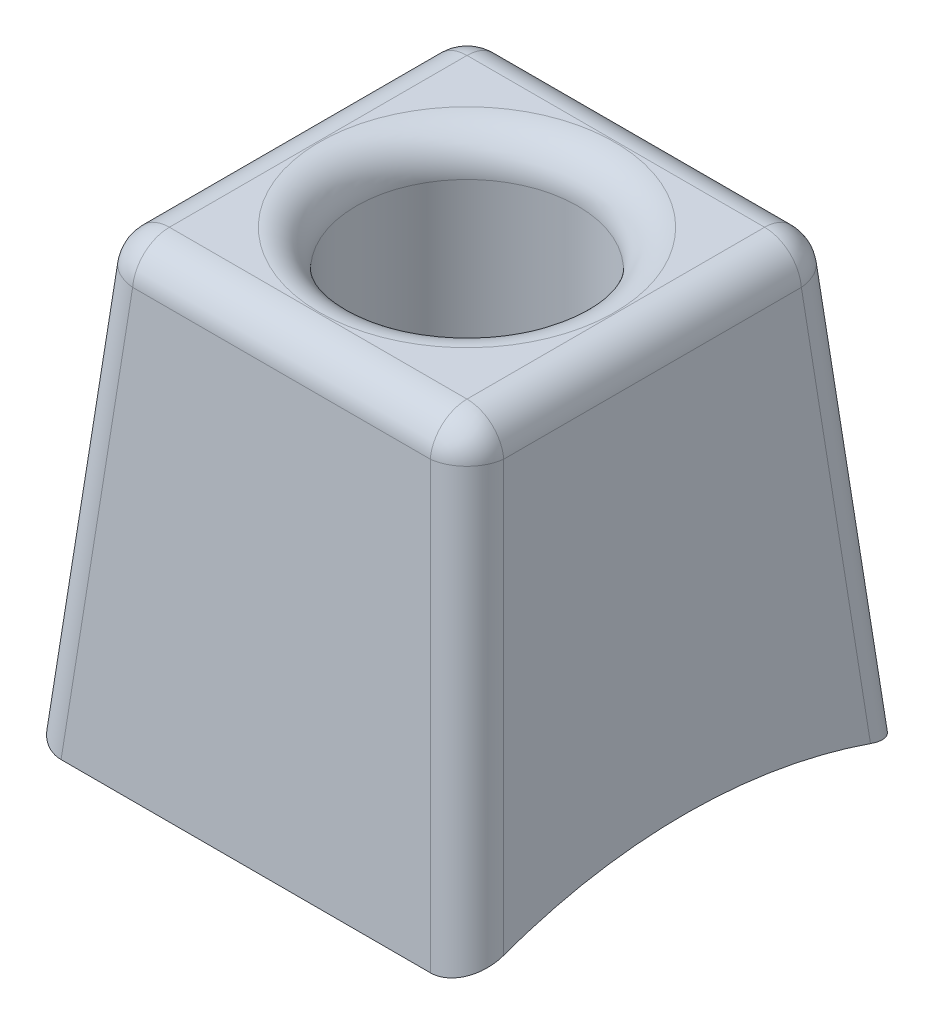
ISO-10303-21;
HEADER;
FILE_DESCRIPTION(('STEP AP214'),'2;1');
FILE_NAME('part.step','',(''),(''),'','','');
FILE_SCHEMA(('AUTOMOTIVE_DESIGN { 1 0 10303 214 1 1 1 1 }'));
ENDSEC;
DATA;
#1=APPLICATION_CONTEXT('core data for automotive mechanical design processes');
#2=APPLICATION_PROTOCOL_DEFINITION('international standard','automotive_design',2000,#1);
#3=PRODUCT_CONTEXT('',#1,'mechanical');
#4=PRODUCT('Part','Part','',(#3));
#5=PRODUCT_RELATED_PRODUCT_CATEGORY('part','',(#4));
#6=PRODUCT_DEFINITION_FORMATION('','',#4);
#7=PRODUCT_DEFINITION_CONTEXT('part definition',#1,'design');
#8=PRODUCT_DEFINITION('design','',#6,#7);
#9=PRODUCT_DEFINITION_SHAPE('','',#8);
#10=(LENGTH_UNIT() NAMED_UNIT(*) SI_UNIT(.MILLI.,.METRE.));
#11=(NAMED_UNIT(*) PLANE_ANGLE_UNIT() SI_UNIT($,.RADIAN.));
#12=(NAMED_UNIT(*) SI_UNIT($,.STERADIAN.) SOLID_ANGLE_UNIT());
#13=UNCERTAINTY_MEASURE_WITH_UNIT(LENGTH_MEASURE(1.E-05),#10,'distance_accuracy_value','');
#14=(GEOMETRIC_REPRESENTATION_CONTEXT(3) GLOBAL_UNCERTAINTY_ASSIGNED_CONTEXT((#13)) GLOBAL_UNIT_ASSIGNED_CONTEXT((#10,
#11,#12)) REPRESENTATION_CONTEXT('',''));
#15=CARTESIAN_POINT('',(0.,0.,0.));
#16=DIRECTION('',(0.,0.,1.));
#17=DIRECTION('',(1.,0.,0.));
#18=AXIS2_PLACEMENT_3D('',#15,#16,#17);
#19=CARTESIAN_POINT('',(0.,0.,0.));
#20=DIRECTION('',(0.996194698091746,0.0871557427476582,0.));
#21=DIRECTION('',(-0.0871557427476582,0.996194698091746,0.));
#22=AXIS2_PLACEMENT_3D('',#19,#20,#21);
#23=PLANE('',#22);
#24=DIRECTION('',(-0.0868265938642476,0.992432509138967,-0.0868265938642476));
#25=VECTOR('',#24,1.);
#26=CARTESIAN_POINT('',(0.00751016977360886,-0.0858416333149665,-0.988684528318136));
#27=LINE('',#26,#25);
#28=CARTESIAN_POINT('',(-0.970000438236766,11.0871557427477,-1.96619513632851));
#29=VERTEX_POINT('',#28);
#30=CARTESIAN_POINT('',(-0.0328801020594315,0.375821286259433,-1.02907480015118));
#31=VERTEX_POINT('',#30);
#32=EDGE_CURVE('E140',#29,#31,#27,.F.);
#33=ORIENTED_EDGE('',*,*,#32,.T.);
#34=CARTESIAN_POINT('',(1.29766658815796,-14.8323969741913,-6.));
#35=DIRECTION('',(0.996194698091746,0.0871557427476582,0.));
#36=DIRECTION('',(0.0871557427476582,-0.996194698091746,0.));
#37=AXIS2_PLACEMENT_3D('',#34,#35,#36);
#38=ELLIPSE('',#37,16.0611174006936,16.);
#39=CARTESIAN_POINT('',(-0.0328801020594315,0.375821286259436,-10.9709251998488));
#40=VERTEX_POINT('',#39);
#41=EDGE_CURVE('E258',#31,#40,#38,.F.);
#42=ORIENTED_EDGE('',*,*,#41,.T.);
#43=DIRECTION('',(-0.0868265938642476,0.992432509138967,0.0868265938642477));
#44=VECTOR('',#43,1.);
#45=CARTESIAN_POINT('',(-0.0829561190511952,0.948192779589257,-10.9208491828571));
#46=LINE('',#45,#44);
#47=CARTESIAN_POINT('',(-0.970000438236766,11.0871557427477,-10.0338048636715));
#48=VERTEX_POINT('',#47);
#49=EDGE_CURVE('E148',#40,#48,#46,.T.);
#50=ORIENTED_EDGE('',*,*,#49,.T.);
#51=DIRECTION('',(0.,0.,-1.));
#52=VECTOR('',#51,1.);
#53=CARTESIAN_POINT('',(-0.970000438236766,11.0871557427477,-1.04986396231109));
#54=LINE('',#53,#52);
#55=EDGE_CURVE('E138',#48,#29,#54,.F.);
#56=ORIENTED_EDGE('',*,*,#55,.T.);
#57=EDGE_LOOP('',(#33,#42,#50,#56));
#58=FACE_BOUND('',#57,.T.);
#59=ADVANCED_FACE('F34',(#58),#23,.T.);
#60=CARTESIAN_POINT('',(0.,0.,-12.));
#61=DIRECTION('',(0.,0.0871557427476582,-0.996194698091746));
#62=DIRECTION('',(0.,0.996194698091746,0.0871557427476582));
#63=AXIS2_PLACEMENT_3D('',#60,#61,#62);
#64=PLANE('',#63);
#65=DIRECTION('',(-1.,0.,0.));
#66=VECTOR('',#65,1.);
#67=CARTESIAN_POINT('',(0.,0.,-12.));
#68=LINE('',#67,#66);
#69=CARTESIAN_POINT('',(-0.996194698091746,0.,-12.));
#70=VERTEX_POINT('',#69);
#71=CARTESIAN_POINT('',(-11.0038053019083,0.,-12.));
#72=VERTEX_POINT('',#71);
#73=EDGE_CURVE('E118',#70,#72,#68,.T.);
#74=ORIENTED_EDGE('',*,*,#73,.T.);
#75=DIRECTION('',(0.0868265938642476,0.992432509138967,0.0868265938642476));
#76=VECTOR('',#75,1.);
#77=CARTESIAN_POINT('',(-10.9208491828571,0.948192779589257,-11.9170438809488));
#78=LINE('',#77,#76);
#79=CARTESIAN_POINT('',(-10.0338048636715,11.0871557427477,-11.0299995617632));
#80=VERTEX_POINT('',#79);
#81=EDGE_CURVE('E127',#72,#80,#78,.T.);
#82=ORIENTED_EDGE('',*,*,#81,.T.);
#83=DIRECTION('',(-1.,0.,0.));
#84=VECTOR('',#83,1.);
#85=CARTESIAN_POINT('',(-1.04986396231109,11.0871557427477,-11.0299995617632));
#86=LINE('',#85,#84);
#87=CARTESIAN_POINT('',(-1.96619513632851,11.0871557427477,-11.0299995617632));
#88=VERTEX_POINT('',#87);
#89=EDGE_CURVE('E142',#80,#88,#86,.F.);
#90=ORIENTED_EDGE('',*,*,#89,.T.);
#91=DIRECTION('',(-0.0868265938642476,0.992432509138967,0.0868265938642476));
#92=VECTOR('',#91,1.);
#93=CARTESIAN_POINT('',(-0.988684528318137,-0.0858416333149666,-12.0075101697736));
#94=LINE('',#93,#92);
#95=EDGE_CURVE('E130',#88,#70,#94,.F.);
#96=ORIENTED_EDGE('',*,*,#95,.T.);
#97=EDGE_LOOP('',(#74,#82,#90,#96));
#98=FACE_BOUND('',#97,.T.);
#99=ADVANCED_FACE('F126',(#98),#64,.T.);
#100=CARTESIAN_POINT('',(-12.,0.,0.));
#101=DIRECTION('',(-0.996194698091746,0.0871557427476582,0.));
#102=DIRECTION('',(-0.0871557427476582,-0.996194698091746,0.));
#103=AXIS2_PLACEMENT_3D('',#100,#101,#102);
#104=PLANE('',#103);
#105=DIRECTION('',(0.0868265938642476,0.992432509138967,0.0868265938642476));
#106=VECTOR('',#105,1.);
#107=CARTESIAN_POINT('',(-11.9170438809488,0.948192779589257,-10.9208491828571));
#108=LINE('',#107,#106);
#109=CARTESIAN_POINT('',(-11.0299995617632,11.0871557427477,-10.0338048636715));
#110=VERTEX_POINT('',#109);
#111=CARTESIAN_POINT('',(-11.9671198979406,0.375821286259438,-10.9709251998488));
#112=VERTEX_POINT('',#111);
#113=EDGE_CURVE('E222',#110,#112,#108,.F.);
#114=ORIENTED_EDGE('',*,*,#113,.T.);
#115=CARTESIAN_POINT('',(-13.297666588158,-14.8323969741913,-6.));
#116=DIRECTION('',(-0.996194698091746,0.0871557427476582,0.));
#117=DIRECTION('',(0.0871557427476582,0.996194698091746,0.));
#118=AXIS2_PLACEMENT_3D('',#115,#116,#117);
#119=ELLIPSE('',#118,16.0611174006936,16.);
#120=CARTESIAN_POINT('',(-11.9671198979406,0.375821286259433,-1.02907480015118));
#121=VERTEX_POINT('',#120);
#122=EDGE_CURVE('E55',#112,#121,#119,.F.);
#123=ORIENTED_EDGE('',*,*,#122,.T.);
#124=DIRECTION('',(0.0868265938642476,0.992432509138967,-0.0868265938642477));
#125=VECTOR('',#124,1.);
#126=CARTESIAN_POINT('',(-12.0075101697736,-0.0858416333149666,-0.988684528318135));
#127=LINE('',#126,#125);
#128=CARTESIAN_POINT('',(-11.0299995617632,11.0871557427477,-1.96619513632851));
#129=VERTEX_POINT('',#128);
#130=EDGE_CURVE('E220',#121,#129,#127,.T.);
#131=ORIENTED_EDGE('',*,*,#130,.T.);
#132=DIRECTION('',(0.,0.,1.));
#133=VECTOR('',#132,1.);
#134=CARTESIAN_POINT('',(-11.0299995617632,11.0871557427477,-10.9501360376889));
#135=LINE('',#134,#133);
#136=EDGE_CURVE('E218',#129,#110,#135,.F.);
#137=ORIENTED_EDGE('',*,*,#136,.T.);
#138=EDGE_LOOP('',(#114,#123,#131,#137));
#139=FACE_BOUND('',#138,.T.);
#140=ADVANCED_FACE('F248',(#139),#104,.T.);
#141=CARTESIAN_POINT('',(0.,0.,0.));
#142=DIRECTION('',(0.,0.0871557427476582,0.996194698091746));
#143=DIRECTION('',(0.,-0.996194698091746,0.0871557427476582));
#144=AXIS2_PLACEMENT_3D('',#141,#142,#143);
#145=PLANE('',#144);
#146=DIRECTION('',(1.,0.,0.));
#147=VECTOR('',#146,1.);
#148=CARTESIAN_POINT('',(0.,0.,0.));
#149=LINE('',#148,#147);
#150=CARTESIAN_POINT('',(-11.0038053019083,0.,0.));
#151=VERTEX_POINT('',#150);
#152=CARTESIAN_POINT('',(-0.996194698091746,0.,0.));
#153=VERTEX_POINT('',#152);
#154=EDGE_CURVE('E131',#151,#153,#149,.T.);
#155=ORIENTED_EDGE('',*,*,#154,.T.);
#156=DIRECTION('',(-0.0868265938642476,0.992432509138967,-0.0868265938642476));
#157=VECTOR('',#156,1.);
#158=CARTESIAN_POINT('',(-0.988684528318136,-0.0858416333149665,0.00751016977360898));
#159=LINE('',#158,#157);
#160=CARTESIAN_POINT('',(-1.96619513632851,11.0871557427477,-0.970000438236766));
#161=VERTEX_POINT('',#160);
#162=EDGE_CURVE('E49',#153,#161,#159,.T.);
#163=ORIENTED_EDGE('',*,*,#162,.T.);
#164=DIRECTION('',(1.,0.,0.));
#165=VECTOR('',#164,1.);
#166=CARTESIAN_POINT('',(-10.9501360376889,11.0871557427477,-0.970000438236765));
#167=LINE('',#166,#165);
#168=CARTESIAN_POINT('',(-10.0338048636715,11.0871557427477,-0.970000438236765));
#169=VERTEX_POINT('',#168);
#170=EDGE_CURVE('E63',#161,#169,#167,.F.);
#171=ORIENTED_EDGE('',*,*,#170,.T.);
#172=DIRECTION('',(0.0868265938642476,0.992432509138967,-0.0868265938642476));
#173=VECTOR('',#172,1.);
#174=CARTESIAN_POINT('',(-10.9208491828571,0.948192779589257,-0.0829561190511938));
#175=LINE('',#174,#173);
#176=EDGE_CURVE('E151',#169,#151,#175,.F.);
#177=ORIENTED_EDGE('',*,*,#176,.T.);
#178=EDGE_LOOP('',(#155,#163,#171,#177));
#179=FACE_BOUND('',#178,.T.);
#180=ADVANCED_FACE('F255',(#179),#145,.T.);
#181=CARTESIAN_POINT('',(0.,12.,0.));
#182=DIRECTION('',(0.,1.,0.));
#183=DIRECTION('',(0.,0.,1.));
#184=AXIS2_PLACEMENT_3D('',#181,#182,#183);
#185=PLANE('',#184);
#186=CARTESIAN_POINT('',(-6.,12.,-6.));
#187=DIRECTION('',(0.,1.,0.));
#188=DIRECTION('',(0.,0.,1.));
#189=AXIS2_PLACEMENT_3D('',#186,#187,#188);
#190=CIRCLE('',#189,4.);
#191=CARTESIAN_POINT('',(-6.,12.,-2.));
#192=VERTEX_POINT('',#191);
#193=EDGE_CURVE('E215',#192,#192,#190,.F.);
#194=ORIENTED_EDGE('',*,*,#193,.T.);
#195=EDGE_LOOP('',(#194));
#196=FACE_BOUND('',#195,.T.);
#197=DIRECTION('',(0.,0.,1.));
#198=VECTOR('',#197,1.);
#199=CARTESIAN_POINT('',(-1.96619513632851,12.,-10.9501360376889));
#200=LINE('',#199,#198);
#201=CARTESIAN_POINT('',(-1.96619513632851,12.,-1.96619513632851));
#202=VERTEX_POINT('',#201);
#203=CARTESIAN_POINT('',(-1.96619513632851,12.,-10.0338048636715));
#204=VERTEX_POINT('',#203);
#205=EDGE_CURVE('E199',#202,#204,#200,.F.);
#206=ORIENTED_EDGE('',*,*,#205,.T.);
#207=DIRECTION('',(1.,0.,0.));
#208=VECTOR('',#207,1.);
#209=CARTESIAN_POINT('',(-10.9501360376889,12.,-10.0338048636715));
#210=LINE('',#209,#208);
#211=CARTESIAN_POINT('',(-10.0338048636715,12.,-10.0338048636715));
#212=VERTEX_POINT('',#211);
#213=EDGE_CURVE('E213',#204,#212,#210,.F.);
#214=ORIENTED_EDGE('',*,*,#213,.T.);
#215=DIRECTION('',(0.,0.,-1.));
#216=VECTOR('',#215,1.);
#217=CARTESIAN_POINT('',(-10.0338048636715,12.,-1.04986396231109));
#218=LINE('',#217,#216);
#219=CARTESIAN_POINT('',(-10.0338048636715,12.,-1.96619513632851));
#220=VERTEX_POINT('',#219);
#221=EDGE_CURVE('E206',#212,#220,#218,.F.);
#222=ORIENTED_EDGE('',*,*,#221,.T.);
#223=DIRECTION('',(-1.,0.,0.));
#224=VECTOR('',#223,1.);
#225=CARTESIAN_POINT('',(-1.04986396231109,12.,-1.96619513632851));
#226=LINE('',#225,#224);
#227=EDGE_CURVE('E203',#220,#202,#226,.F.);
#228=ORIENTED_EDGE('',*,*,#227,.T.);
#229=EDGE_LOOP('',(#206,#214,#222,#228));
#230=FACE_BOUND('',#229,.T.);
#231=ADVANCED_FACE('F234',(#196,#230),#185,.T.);
#232=CARTESIAN_POINT('',(-6.,0.,-6.));
#233=DIRECTION('',(0.,1.,0.));
#234=DIRECTION('',(0.,0.,1.));
#235=AXIS2_PLACEMENT_3D('',#232,#233,#234);
#236=CYLINDRICAL_SURFACE('',#235,3.);
#237=CARTESIAN_POINT('',(-6.,0.883836671310385,-3.));
#238=CARTESIAN_POINT('',(-6.16691441602524,0.883839901710043,-3.00000640233411));
#239=CARTESIAN_POINT('',(-6.33391189643725,0.88652462102244,-3.01397747302102));
#240=CARTESIAN_POINT('',(-6.66319792316334,0.896960046087501,-3.06945493496415));
#241=CARTESIAN_POINT('',(-6.82548235285483,0.904715049270513,-3.11098468463053));
#242=CARTESIAN_POINT('',(-7.14053014274188,0.924382555108625,-3.22025928764418));
#243=CARTESIAN_POINT('',(-7.29330221861461,0.936291183929216,-3.2879797209125));
#244=CARTESIAN_POINT('',(-7.58530711857359,0.962919552227247,-3.4476486847927));
#245=CARTESIAN_POINT('',(-7.72454099800659,0.977639072320943,-3.53959532481614));
#246=CARTESIAN_POINT('',(-7.98726039839828,1.00843532258773,-3.74632642114755));
#247=CARTESIAN_POINT('',(-8.11055296694346,1.0245253583223,-3.86135414133816));
#248=CARTESIAN_POINT('',(-8.33620877919912,1.05613217908931,-4.1104564423929));
#249=CARTESIAN_POINT('',(-8.43857064884959,1.07164892643172,-4.24453227275011));
#250=CARTESIAN_POINT('',(-8.62019875320103,1.10050338237679,-4.52919221085967));
#251=CARTESIAN_POINT('',(-8.69928306703884,1.11382358685594,-4.67989431993227));
#252=CARTESIAN_POINT('',(-8.83093908454707,1.13663519846728,-4.99273743349847));
#253=CARTESIAN_POINT('',(-8.88351296798044,1.14612692037535,-5.15487749628099));
#254=CARTESIAN_POINT('',(-8.96005909722227,1.16011812828424,-5.48399450762517));
#255=CARTESIAN_POINT('',(-8.98435661184537,1.16467434533521,-5.65089335351028));
#256=CARTESIAN_POINT('',(-9.0046737754008,1.16847671812056,-5.98645664792923));
#257=CARTESIAN_POINT('',(-9.00069583227812,1.16772332602261,-6.15512094489534));
#258=CARTESIAN_POINT('',(-8.9648244577057,1.1610357010735,-6.48719671579879));
#259=CARTESIAN_POINT('',(-8.93328126113998,1.15516647075295,-6.65064752090294));
#260=CARTESIAN_POINT('',(-8.84372870120953,1.1389795524799,-6.96989433143095));
#261=CARTESIAN_POINT('',(-8.78571837330839,1.12866170240799,-7.12569005765308));
#262=CARTESIAN_POINT('',(-8.6445445378834,1.10462823175546,-7.42622013150304));
#263=CARTESIAN_POINT('',(-8.56124102417501,1.09089377762518,-7.57088714367706));
#264=CARTESIAN_POINT('',(-8.37194866184569,1.06154597666567,-7.84431995442927));
#265=CARTESIAN_POINT('',(-8.26595750622484,1.04593243883195,-7.97308413382157));
#266=CARTESIAN_POINT('',(-8.03236859403294,1.01427329942001,-8.21313123793807));
#267=CARTESIAN_POINT('',(-7.90446443219585,0.998224743841106,-8.32411581514082));
#268=CARTESIAN_POINT('',(-7.63170093744275,0.967733204301089,-8.52310343702521));
#269=CARTESIAN_POINT('',(-7.48684135647073,0.953290243835689,-8.61110614542364));
#270=CARTESIAN_POINT('',(-7.18388345859468,0.927640891951102,-8.76171704448955));
#271=CARTESIAN_POINT('',(-7.02576308561871,0.916440036413894,-8.82428187290843));
#272=CARTESIAN_POINT('',(-6.7009976317536,0.898627873742458,-8.92187313950112));
#273=CARTESIAN_POINT('',(-6.53435351907043,0.892016046581068,-8.95690269802216));
#274=CARTESIAN_POINT('',(-6.19996134228824,0.884233431828783,-8.99799345299478));
#275=CARTESIAN_POINT('',(-6.03226776886897,0.882982142131403,-9.00448328571717));
#276=CARTESIAN_POINT('',(-5.69819308982571,0.885846854225474,-8.98945937763449));
#277=CARTESIAN_POINT('',(-5.53181191970384,0.889962590580894,-8.96794702172866));
#278=CARTESIAN_POINT('',(-5.20649419389123,0.903022627072779,-8.89789736391765));
#279=CARTESIAN_POINT('',(-5.04750749475021,0.911926759626247,-8.84958477167979));
#280=CARTESIAN_POINT('',(-4.73988562053969,0.93352570894105,-8.72754448758119));
#281=CARTESIAN_POINT('',(-4.59125120936934,0.946220805074297,-8.6538149225759));
#282=CARTESIAN_POINT('',(-4.30666476191367,0.974154583082376,-8.4820470623932));
#283=CARTESIAN_POINT('',(-4.17087892426786,0.98942093431498,-8.38373799279242));
#284=CARTESIAN_POINT('',(-3.91757591957134,1.02069925317068,-8.16596688688493));
#285=CARTESIAN_POINT('',(-3.80006039688845,1.03671128773855,-8.04650294866167));
#286=CARTESIAN_POINT('',(-3.58503247293175,1.06793550592759,-7.78789883574077));
#287=CARTESIAN_POINT('',(-3.48780834678807,1.08313414247477,-7.64851706819178));
#288=CARTESIAN_POINT('',(-3.31815758764467,1.11079112201569,-7.35514904608028));
#289=CARTESIAN_POINT('',(-3.24572999994999,1.12324957050319,-7.20116335407705));
#290=CARTESIAN_POINT('',(-3.12815980427184,1.14396418572561,-6.88375508315737));
#291=CARTESIAN_POINT('',(-3.08287562487718,1.15224212041147,-6.72038642615798));
#292=CARTESIAN_POINT('',(-3.02042590342023,1.16375586748361,-6.38819245476314));
#293=CARTESIAN_POINT('',(-3.00325740267459,1.1669922104075,-6.21936771643169));
#294=CARTESIAN_POINT('',(-2.99762939696311,1.16804757611732,-5.88381847949899));
#295=CARTESIAN_POINT('',(-3.00873449374091,1.16594875830869,-5.71710138586749));
#296=CARTESIAN_POINT('',(-3.05838485553691,1.15674035804335,-5.38795326144158));
#297=CARTESIAN_POINT('',(-3.09692985748858,1.14963082362443,-5.22552218957254));
#298=CARTESIAN_POINT('',(-3.20018241476728,1.13119978536725,-4.90978704880911));
#299=CARTESIAN_POINT('',(-3.26484362576144,1.11988574543153,-4.75646736136386));
#300=CARTESIAN_POINT('',(-3.41844090731094,1.09427046719275,-4.4627887373663));
#301=CARTESIAN_POINT('',(-3.50737860421546,1.07996902877065,-4.3224306699923));
#302=CARTESIAN_POINT('',(-3.70850290888246,1.04969862297471,-4.05648994444115));
#303=CARTESIAN_POINT('',(-3.82100406771521,1.03370871751096,-3.93114752922333));
#304=CARTESIAN_POINT('',(-4.06540912499362,1.00199569670852,-3.7009692786859));
#305=CARTESIAN_POINT('',(-4.19731758077808,0.986272645003964,-3.59613827348799));
#306=CARTESIAN_POINT('',(-4.47825290938013,0.956714573862472,-3.40904732110595));
#307=CARTESIAN_POINT('',(-4.62742687922859,0.942898369682257,-3.32700518941953));
#308=CARTESIAN_POINT('',(-4.93765157985209,0.918944717107139,-3.18927735158849));
#309=CARTESIAN_POINT('',(-5.09869093315073,0.908803798401455,-3.13356676723538));
#310=CARTESIAN_POINT('',(-5.38350457614773,0.895463351935836,-3.0614054680677));
#311=CARTESIAN_POINT('',(-5.50561144752819,0.891129240244337,-3.03841788520061));
#312=CARTESIAN_POINT('',(-5.75179693683633,0.885314737641742,-3.00771297847808));
#313=CARTESIAN_POINT('',(-5.87587550099934,0.8838342690509,-2.99999523895818));
#314=CARTESIAN_POINT('',(-6.,0.883836671310385,-3.));
#315=B_SPLINE_CURVE_WITH_KNOTS('',3,(#237,#238,#239,#240,#241,#242,#243,#244,#245,#246,#247,
#248,#249,#250,#251,#252,#253,#254,#255,#256,#257,#258,#259,#260,#261,#262,#263,#264,#265,#266,
#267,#268,#269,#270,#271,#272,#273,#274,#275,#276,#277,#278,#279,#280,#281,#282,#283,#284,#285,
#286,#287,#288,#289,#290,#291,#292,#293,#294,#295,#296,#297,#298,#299,#300,#301,#302,#303,#304,
#305,#306,#307,#308,#309,#310,#311,#312,#313,#314),.UNSPECIFIED.,.T.,.F.,(4,2,2,2,2,2,2,2,2,2,2,
2,2,2,2,2,2,2,2,2,2,2,2,2,2,2,2,2,2,2,2,2,2,2,2,2,2,2,4),(0.,0.500289011586372,1.00100260476079,
1.50125045595686,2.00145927987816,2.50724671397382,3.01306734138629,3.52274208696095,
4.0323749187928,4.53608550920522,5.03975320401296,5.53711301197449,6.03449094656849,
6.53467383968438,7.03490761823571,7.54281229528128,8.050724403848,8.55949872236533,
9.06821537732975,9.5692649717415,10.0702897867744,10.5671758463074,11.0640985324863,
11.5667572530829,12.0694611878935,12.5788825099174,13.0882842164341,13.5950053883737,
14.1016732333466,14.6005860114028,15.0994940064433,15.5975205306072,16.0955804271422,
16.6007692801749,17.1060769546153,17.6160600363781,18.1255603150176,18.4976061505795,
18.8696418584437),.UNSPECIFIED.);
#316=CARTESIAN_POINT('',(-6.,0.883836671310385,-3.));
#317=VERTEX_POINT('',#316);
#318=EDGE_CURVE('E156',#317,#317,#315,.T.);
#319=ORIENTED_EDGE('',*,*,#318,.T.);
#320=EDGE_LOOP('',(#319));
#321=FACE_BOUND('',#320,.T.);
#322=CARTESIAN_POINT('',(-6.,11.,-6.));
#323=DIRECTION('',(0.,1.,0.));
#324=DIRECTION('',(0.,0.,1.));
#325=AXIS2_PLACEMENT_3D('',#322,#323,#324);
#326=CIRCLE('',#325,3.);
#327=CARTESIAN_POINT('',(-6.,11.,-3.));
#328=VERTEX_POINT('',#327);
#329=EDGE_CURVE('E204',#328,#328,#326,.T.);
#330=ORIENTED_EDGE('',*,*,#329,.T.);
#331=EDGE_LOOP('',(#330));
#332=FACE_BOUND('',#331,.T.);
#333=ADVANCED_FACE('F281',(#321,#332),#236,.F.);
#334=CARTESIAN_POINT('',(-6.,11.,-6.));
#335=DIRECTION('',(0.,1.,0.));
#336=DIRECTION('',(0.,0.,1.));
#337=AXIS2_PLACEMENT_3D('',#334,#335,#336);
#338=TOROIDAL_SURFACE('',#337,4.,1.);
#339=ORIENTED_EDGE('',*,*,#193,.F.);
#340=EDGE_LOOP('',(#339));
#341=FACE_BOUND('',#340,.T.);
#342=ORIENTED_EDGE('',*,*,#329,.F.);
#343=EDGE_LOOP('',(#342));
#344=FACE_BOUND('',#343,.T.);
#345=ADVANCED_FACE('F308',(#341,#344),#338,.T.);
#346=CARTESIAN_POINT('',(-0.988684528318137,-0.172997376062625,-0.988684528318136));
#347=DIRECTION('',(0.0868265938642476,-0.992432509138967,0.0868265938642476));
#348=DIRECTION('',(0.996194698091746,0.0871557427476582,0.));
#349=AXIS2_PLACEMENT_3D('',#346,#347,#348);
#350=CYLINDRICAL_SURFACE('',#349,1.);
#351=CARTESIAN_POINT('',(-0.0328801020594315,0.375821286259435,-1.02907480015118));
#352=CARTESIAN_POINT('',(-0.0310906236083,0.355646880434087,-0.967302179781614));
#353=CARTESIAN_POINT('',(-0.0346908515399377,0.335013720139817,-0.905499565283028));
#354=CARTESIAN_POINT('',(-0.0526028514560985,0.293442376801326,-0.783389872858417));
#355=CARTESIAN_POINT('',(-0.0669429810605713,0.272503530392398,-0.723087191654662));
#356=CARTESIAN_POINT('',(-0.106305288788736,0.231015906665482,-0.605789737364388));
#357=CARTESIAN_POINT('',(-0.131343613451549,0.210467768197387,-0.548800112903491));
#358=CARTESIAN_POINT('',(-0.191774163577683,0.170648345493817,-0.440146869064404));
#359=CARTESIAN_POINT('',(-0.227155446187087,0.151375738040969,-0.388477698373552));
#360=CARTESIAN_POINT('',(-0.30544263980098,0.116048206235288,-0.295059119460081));
#361=CARTESIAN_POINT('',(-0.347829195243232,0.0998747562122875,-0.252920991442688));
#362=CARTESIAN_POINT('',(-0.440361660180504,0.0704066950759407,-0.176933119591518));
#363=CARTESIAN_POINT('',(-0.4905035324625,0.0571105946818074,-0.143079086819762));
#364=CARTESIAN_POINT('',(-0.591474212794392,0.035452309886854,-0.0883304156792656));
#365=CARTESIAN_POINT('',(-0.641695030574393,0.0267219436280349,-0.0664572618774144));
#366=CARTESIAN_POINT('',(-0.745583331227509,0.0127930964808726,-0.0316929871358022));
#367=CARTESIAN_POINT('',(-0.799245062069285,0.0075888812954056,-0.0187872822754869));
#368=CARTESIAN_POINT('',(-0.877237117117708,0.00285815865296272,-0.00706947684205618));
#369=CARTESIAN_POINT('',(-0.900958173550731,0.00178540794962175,-0.00441514916263489));
#370=CARTESIAN_POINT('',(-0.948513704081546,0.000356891291794044,-0.000882114715400421));
#371=CARTESIAN_POINT('',(-0.972347920860211,-7.55307293417992E-08,-4.33977561805719E-07));
#372=CARTESIAN_POINT('',(-0.996194698091745,0.,0.));
#373=B_SPLINE_CURVE_WITH_KNOTS('',3,(#351,#352,#353,#354,#355,#356,#357,#358,#359,#360,#361,
#362,#363,#364,#365,#366,#367,#368,#369,#370,#371,#372),.UNSPECIFIED.,.F.,.F.,(4,2,2,2,2,2,2,2,
2,2,4),(0.,0.194844684625212,0.390205658660602,0.585862533862235,0.781313148607658,
0.966040138986783,1.15067128704594,1.31619711340921,1.48145310812224,1.55306918217479,
1.62456500533274),.UNSPECIFIED.);
#374=EDGE_CURVE('E257',#31,#153,#373,.T.);
#375=ORIENTED_EDGE('',*,*,#374,.F.);
#376=ORIENTED_EDGE('',*,*,#32,.F.);
#377=CARTESIAN_POINT('',(-1.96619513632851,11.,-1.96619513632851));
#378=DIRECTION('',(-0.0868265938642481,0.992432509138967,-0.0868265938642482));
#379=DIRECTION('',(0.,0.0871557427476587,0.996194698091746));
#380=AXIS2_PLACEMENT_3D('',#377,#378,#379);
#381=CIRCLE('',#380,1.);
#382=EDGE_CURVE('E132',#161,#29,#381,.T.);
#383=ORIENTED_EDGE('',*,*,#382,.F.);
#384=ORIENTED_EDGE('',*,*,#162,.F.);
#385=EDGE_LOOP('',(#375,#376,#383,#384));
#386=FACE_BOUND('',#385,.T.);
#387=ADVANCED_FACE('F36',(#386),#350,.T.);
#388=CARTESIAN_POINT('',(-1.96619513632851,11.,-1.96619513632851));
#389=DIRECTION('',(0.,0.,1.));
#390=DIRECTION('',(1.,0.,0.));
#391=AXIS2_PLACEMENT_3D('',#388,#389,#390);
#392=SPHERICAL_SURFACE('',#391,1.);
#393=CARTESIAN_POINT('',(-1.96619513632851,11.,-1.96619513632851));
#394=DIRECTION('',(1.,0.,0.));
#395=DIRECTION('',(0.,0.,-1.));
#396=AXIS2_PLACEMENT_3D('',#393,#394,#395);
#397=CIRCLE('',#396,1.);
#398=EDGE_CURVE('E179',#161,#202,#397,.F.);
#399=ORIENTED_EDGE('',*,*,#398,.F.);
#400=ORIENTED_EDGE('',*,*,#382,.T.);
#401=CARTESIAN_POINT('',(-1.96619513632851,11.,-1.96619513632851));
#402=DIRECTION('',(0.,0.,1.));
#403=DIRECTION('',(1.,0.,0.));
#404=AXIS2_PLACEMENT_3D('',#401,#402,#403);
#405=CIRCLE('',#404,1.);
#406=EDGE_CURVE('E182',#202,#29,#405,.F.);
#407=ORIENTED_EDGE('',*,*,#406,.F.);
#408=EDGE_LOOP('',(#399,#400,#407));
#409=FACE_BOUND('',#408,.T.);
#410=ADVANCED_FACE('F189',(#409),#392,.T.);
#411=CARTESIAN_POINT('',(-0.988684528318136,-0.172997376062625,-11.0113154716819));
#412=DIRECTION('',(0.0868265938642476,-0.992432509138967,-0.0868265938642477));
#413=DIRECTION('',(0.,0.0871557427476582,-0.996194698091746));
#414=AXIS2_PLACEMENT_3D('',#411,#412,#413);
#415=CYLINDRICAL_SURFACE('',#414,1.);
#416=CARTESIAN_POINT('',(-0.996194698091746,0.,-12.));
#417=CARTESIAN_POINT('',(-0.970789208125068,-8.40689069831297E-07,-12.0000011114972));
#418=CARTESIAN_POINT('',(-0.945394974055079,0.000404862761261797,-11.9989992535598));
#419=CARTESIAN_POINT('',(-0.894793875332128,0.00202560674311228,-11.9949907140355));
#420=CARTESIAN_POINT('',(-0.869586992825445,0.00324056912968024,-11.9919842260228));
#421=CARTESIAN_POINT('',(-0.794674861004059,0.00808171169325735,-11.9799892422099));
#422=CARTESIAN_POINT('',(-0.745485303750999,0.0129042192325047,-11.9680251634197));
#423=CARTESIAN_POINT('',(-0.650010658206038,0.0255167778762583,-11.9365547073667));
#424=CARTESIAN_POINT('',(-0.603726213004445,0.0333074833564743,-11.9170466669305));
#425=CARTESIAN_POINT('',(-0.515217094027991,0.051472846071937,-11.8712030082265));
#426=CARTESIAN_POINT('',(-0.472993821369942,0.0618483906838125,-11.8448650451154));
#427=CARTESIAN_POINT('',(-0.392576407925392,0.0849846749082312,-11.7855646627362));
#428=CARTESIAN_POINT('',(-0.354504394504153,0.097797027258985,-11.7524574489435));
#429=CARTESIAN_POINT('',(-0.284262276643091,0.125098283616765,-11.6810910266347));
#430=CARTESIAN_POINT('',(-0.252093762175132,0.139587637577266,-11.6428304349715));
#431=CARTESIAN_POINT('',(-0.191499744633614,0.17107822203881,-11.5585901473458));
#432=CARTESIAN_POINT('',(-0.163665541682803,0.188188213689123,-11.5122261954966));
#433=CARTESIAN_POINT('',(-0.115830540086819,0.223199726172664,-11.4158698437448));
#434=CARTESIAN_POINT('',(-0.0958364605914685,0.241101911375608,-11.3658743748531));
#435=CARTESIAN_POINT('',(-0.062554316655402,0.278663041123324,-11.2592100679918));
#436=CARTESIAN_POINT('',(-0.0499621667732267,0.298344277139293,-11.2023320159429));
#437=CARTESIAN_POINT('',(-0.0342895506108549,0.337425689184066,-11.0872659442046));
#438=CARTESIAN_POINT('',(-0.0311968410232072,0.356826194887561,-11.0290797081315));
#439=CARTESIAN_POINT('',(-0.0328801020594316,0.375821286259437,-10.9709251998488));
#440=B_SPLINE_CURVE_WITH_KNOTS('',3,(#416,#417,#418,#419,#420,#421,#422,#423,#424,#425,#426,
#427,#428,#429,#430,#431,#432,#433,#434,#435,#436,#437,#438,#439),.UNSPECIFIED.,.F.,.F.,(4,2,2,
2,2,2,2,2,2,2,2,4),(0.,0.0761705002660946,0.152333646301088,0.30408908448292,0.455877998393677,
0.607719093498848,0.763232110810143,0.918786950709431,1.08824138929693,1.25784073812676,
1.44154348828358,1.62500937448402),.UNSPECIFIED.);
#441=EDGE_CURVE('E228',#70,#40,#440,.T.);
#442=ORIENTED_EDGE('',*,*,#441,.F.);
#443=ORIENTED_EDGE('',*,*,#95,.F.);
#444=CARTESIAN_POINT('',(-1.96619513632851,11.,-10.0338048636715));
#445=DIRECTION('',(-0.0868265938642481,0.992432509138967,0.0868265938642481));
#446=DIRECTION('',(-0.996194698091746,-0.0871557427476587,0.));
#447=AXIS2_PLACEMENT_3D('',#444,#445,#446);
#448=CIRCLE('',#447,1.);
#449=EDGE_CURVE('E176',#48,#88,#448,.T.);
#450=ORIENTED_EDGE('',*,*,#449,.F.);
#451=ORIENTED_EDGE('',*,*,#49,.F.);
#452=EDGE_LOOP('',(#442,#443,#450,#451));
#453=FACE_BOUND('',#452,.T.);
#454=ADVANCED_FACE('F226',(#453),#415,.T.);
#455=CARTESIAN_POINT('',(-1.96619513632851,11.,0.));
#456=DIRECTION('',(0.,0.,-1.));
#457=DIRECTION('',(-1.,0.,0.));
#458=AXIS2_PLACEMENT_3D('',#455,#456,#457);
#459=CYLINDRICAL_SURFACE('',#458,1.);
#460=ORIENTED_EDGE('',*,*,#406,.T.);
#461=ORIENTED_EDGE('',*,*,#55,.F.);
#462=CARTESIAN_POINT('',(-1.96619513632851,11.,-10.0338048636715));
#463=DIRECTION('',(0.,0.,-1.));
#464=DIRECTION('',(-1.,0.,0.));
#465=AXIS2_PLACEMENT_3D('',#462,#463,#464);
#466=CIRCLE('',#465,1.);
#467=EDGE_CURVE('E173',#204,#48,#466,.T.);
#468=ORIENTED_EDGE('',*,*,#467,.F.);
#469=ORIENTED_EDGE('',*,*,#205,.F.);
#470=EDGE_LOOP('',(#460,#461,#468,#469));
#471=FACE_BOUND('',#470,.T.);
#472=ADVANCED_FACE('F196',(#471),#459,.T.);
#473=CARTESIAN_POINT('',(0.,11.,-1.96619513632851));
#474=DIRECTION('',(1.,0.,0.));
#475=DIRECTION('',(0.,0.,-1.));
#476=AXIS2_PLACEMENT_3D('',#473,#474,#475);
#477=CYLINDRICAL_SURFACE('',#476,1.);
#478=ORIENTED_EDGE('',*,*,#398,.T.);
#479=ORIENTED_EDGE('',*,*,#227,.F.);
#480=CARTESIAN_POINT('',(-10.0338048636715,11.,-1.96619513632851));
#481=DIRECTION('',(-1.,0.,0.));
#482=DIRECTION('',(0.,-1.,0.));
#483=AXIS2_PLACEMENT_3D('',#480,#481,#482);
#484=CIRCLE('',#483,1.);
#485=EDGE_CURVE('E170',#169,#220,#484,.T.);
#486=ORIENTED_EDGE('',*,*,#485,.F.);
#487=ORIENTED_EDGE('',*,*,#170,.F.);
#488=EDGE_LOOP('',(#478,#479,#486,#487));
#489=FACE_BOUND('',#488,.T.);
#490=ADVANCED_FACE('F240',(#489),#477,.T.);
#491=CARTESIAN_POINT('',(-10.9208491828571,0.861037036841599,-1.07915081714294));
#492=DIRECTION('',(-0.0868265938642476,-0.992432509138967,0.0868265938642477));
#493=DIRECTION('',(0.,-0.0871557427476582,-0.996194698091746));
#494=AXIS2_PLACEMENT_3D('',#491,#492,#493);
#495=CYLINDRICAL_SURFACE('',#494,1.);
#496=CARTESIAN_POINT('',(-11.0038053019083,0.,0.));
#497=CARTESIAN_POINT('',(-11.0292107918749,-8.40689072065296E-07,1.11149722896712E-06));
#498=CARTESIAN_POINT('',(-11.0546050259449,0.000404862761259365,-0.00100074644015589));
#499=CARTESIAN_POINT('',(-11.1052061246679,0.00202560674310997,-0.00500928596451565));
#500=CARTESIAN_POINT('',(-11.1304130071745,0.00324056912967827,-0.00801577397723614));
#501=CARTESIAN_POINT('',(-11.2053251389959,0.00808171169325708,-0.0200107577900963));
#502=CARTESIAN_POINT('',(-11.254514696249,0.0129042192325064,-0.0319748365802829));
#503=CARTESIAN_POINT('',(-11.349989341794,0.025516777876261,-0.0634452926333274));
#504=CARTESIAN_POINT('',(-11.3962737869956,0.033307483356476,-0.0829533330694756));
#505=CARTESIAN_POINT('',(-11.484782905972,0.0514728460719369,-0.128796991773454));
#506=CARTESIAN_POINT('',(-11.5270061786301,0.0618483906838116,-0.155134954884596));
#507=CARTESIAN_POINT('',(-11.6074235920746,0.0849846749082294,-0.214435337263749));
#508=CARTESIAN_POINT('',(-11.6454956054958,0.0977970272589831,-0.247542551056515));
#509=CARTESIAN_POINT('',(-11.7157377233569,0.125098283616764,-0.31890897336532));
#510=CARTESIAN_POINT('',(-11.7479062378249,0.139587637577266,-0.357169565028468));
#511=CARTESIAN_POINT('',(-11.8085002553664,0.171078222038808,-0.441409852654153));
#512=CARTESIAN_POINT('',(-11.8363344583172,0.188188213689119,-0.487773804503376));
#513=CARTESIAN_POINT('',(-11.8841694599132,0.223199726172663,-0.584130156255232));
#514=CARTESIAN_POINT('',(-11.9041635394085,0.24110191137561,-0.634125625146908));
#515=CARTESIAN_POINT('',(-11.9374456833446,0.278663041123327,-0.740789932008202));
#516=CARTESIAN_POINT('',(-11.9500378332268,0.298344277139292,-0.797667984057099));
#517=CARTESIAN_POINT('',(-11.9657104493891,0.337425689184059,-0.912734055795374));
#518=CARTESIAN_POINT('',(-11.9688031589768,0.356826194887553,-0.970920291868525));
#519=CARTESIAN_POINT('',(-11.9671198979406,0.375821286259436,-1.02907480015117));
#520=B_SPLINE_CURVE_WITH_KNOTS('',3,(#496,#497,#498,#499,#500,#501,#502,#503,#504,#505,#506,
#507,#508,#509,#510,#511,#512,#513,#514,#515,#516,#517,#518,#519),.UNSPECIFIED.,.F.,.F.,(4,2,2,
2,2,2,2,2,2,2,2,4),(0.,0.076170500266093,0.152333646301088,0.304089084482921,0.455877998393675,
0.607719093498847,0.763232110810144,0.918786950709432,1.08824138929693,1.25784073812676,
1.44154348828358,1.62500937448402),.UNSPECIFIED.);
#521=EDGE_CURVE('E253',#151,#121,#520,.T.);
#522=ORIENTED_EDGE('',*,*,#521,.F.);
#523=ORIENTED_EDGE('',*,*,#176,.F.);
#524=CARTESIAN_POINT('',(-10.0338048636715,11.,-1.96619513632851));
#525=DIRECTION('',(0.0868265938642482,0.992432509138967,-0.0868265938642484));
#526=DIRECTION('',(0.,0.087155742747659,0.996194698091745));
#527=AXIS2_PLACEMENT_3D('',#524,#525,#526);
#528=CIRCLE('',#527,1.);
#529=EDGE_CURVE('E167',#129,#169,#528,.T.);
#530=ORIENTED_EDGE('',*,*,#529,.F.);
#531=ORIENTED_EDGE('',*,*,#130,.F.);
#532=EDGE_LOOP('',(#522,#523,#530,#531));
#533=FACE_BOUND('',#532,.T.);
#534=ADVANCED_FACE('F252',(#533),#495,.T.);
#535=CARTESIAN_POINT('',(-1.96619513632851,11.,-10.0338048636715));
#536=DIRECTION('',(0.,0.,1.));
#537=DIRECTION('',(1.,0.,0.));
#538=AXIS2_PLACEMENT_3D('',#535,#536,#537);
#539=SPHERICAL_SURFACE('',#538,1.);
#540=ORIENTED_EDGE('',*,*,#467,.T.);
#541=ORIENTED_EDGE('',*,*,#449,.T.);
#542=CARTESIAN_POINT('',(-1.96619513632851,11.,-10.0338048636715));
#543=DIRECTION('',(1.,0.,0.));
#544=DIRECTION('',(0.,1.,0.));
#545=AXIS2_PLACEMENT_3D('',#542,#543,#544);
#546=CIRCLE('',#545,1.);
#547=EDGE_CURVE('E164',#204,#88,#546,.F.);
#548=ORIENTED_EDGE('',*,*,#547,.F.);
#549=EDGE_LOOP('',(#540,#541,#548));
#550=FACE_BOUND('',#549,.T.);
#551=ADVANCED_FACE('F230',(#550),#539,.T.);
#552=CARTESIAN_POINT('',(-10.0338048636715,11.,-1.96619513632851));
#553=DIRECTION('',(0.,0.,1.));
#554=DIRECTION('',(1.,0.,0.));
#555=AXIS2_PLACEMENT_3D('',#552,#553,#554);
#556=SPHERICAL_SURFACE('',#555,1.);
#557=ORIENTED_EDGE('',*,*,#529,.T.);
#558=ORIENTED_EDGE('',*,*,#485,.T.);
#559=CARTESIAN_POINT('',(-10.0338048636715,11.,-1.96619513632851));
#560=DIRECTION('',(0.,0.,1.));
#561=DIRECTION('',(1.,0.,0.));
#562=AXIS2_PLACEMENT_3D('',#559,#560,#561);
#563=CIRCLE('',#562,1.);
#564=EDGE_CURVE('E161',#129,#220,#563,.F.);
#565=ORIENTED_EDGE('',*,*,#564,.F.);
#566=EDGE_LOOP('',(#557,#558,#565));
#567=FACE_BOUND('',#566,.T.);
#568=ADVANCED_FACE('F243',(#567),#556,.T.);
#569=CARTESIAN_POINT('',(0.,11.,-10.0338048636715));
#570=DIRECTION('',(-1.,0.,0.));
#571=DIRECTION('',(0.,0.,1.));
#572=AXIS2_PLACEMENT_3D('',#569,#570,#571);
#573=CYLINDRICAL_SURFACE('',#572,1.);
#574=ORIENTED_EDGE('',*,*,#547,.T.);
#575=ORIENTED_EDGE('',*,*,#89,.F.);
#576=CARTESIAN_POINT('',(-10.0338048636715,11.,-10.0338048636715));
#577=DIRECTION('',(-1.,0.,0.));
#578=DIRECTION('',(0.,0.,1.));
#579=AXIS2_PLACEMENT_3D('',#576,#577,#578);
#580=CIRCLE('',#579,1.);
#581=EDGE_CURVE('E158',#212,#80,#580,.T.);
#582=ORIENTED_EDGE('',*,*,#581,.F.);
#583=ORIENTED_EDGE('',*,*,#213,.F.);
#584=EDGE_LOOP('',(#574,#575,#582,#583));
#585=FACE_BOUND('',#584,.T.);
#586=ADVANCED_FACE('F232',(#585),#573,.T.);
#587=CARTESIAN_POINT('',(-10.0338048636715,11.,0.));
#588=DIRECTION('',(0.,0.,1.));
#589=DIRECTION('',(1.,0.,0.));
#590=AXIS2_PLACEMENT_3D('',#587,#588,#589);
#591=CYLINDRICAL_SURFACE('',#590,1.);
#592=ORIENTED_EDGE('',*,*,#564,.T.);
#593=ORIENTED_EDGE('',*,*,#221,.F.);
#594=CARTESIAN_POINT('',(-10.0338048636715,11.,-10.0338048636715));
#595=DIRECTION('',(0.,0.,-1.));
#596=DIRECTION('',(0.,1.,0.));
#597=AXIS2_PLACEMENT_3D('',#594,#595,#596);
#598=CIRCLE('',#597,1.);
#599=EDGE_CURVE('E155',#110,#212,#598,.T.);
#600=ORIENTED_EDGE('',*,*,#599,.F.);
#601=ORIENTED_EDGE('',*,*,#136,.F.);
#602=EDGE_LOOP('',(#592,#593,#600,#601));
#603=FACE_BOUND('',#602,.T.);
#604=ADVANCED_FACE('F246',(#603),#591,.T.);
#605=CARTESIAN_POINT('',(-10.0338048636715,11.,-10.0338048636715));
#606=DIRECTION('',(0.,0.,1.));
#607=DIRECTION('',(1.,0.,0.));
#608=AXIS2_PLACEMENT_3D('',#605,#606,#607);
#609=SPHERICAL_SURFACE('',#608,1.);
#610=ORIENTED_EDGE('',*,*,#599,.T.);
#611=ORIENTED_EDGE('',*,*,#581,.T.);
#612=CARTESIAN_POINT('',(-10.0338048636715,11.,-10.0338048636715));
#613=DIRECTION('',(0.0868265938642482,0.992432509138967,0.0868265938642481));
#614=DIRECTION('',(-0.996194698091746,0.0871557427476588,0.));
#615=AXIS2_PLACEMENT_3D('',#612,#613,#614);
#616=CIRCLE('',#615,1.);
#617=EDGE_CURVE('E137',#110,#80,#616,.F.);
#618=ORIENTED_EDGE('',*,*,#617,.F.);
#619=EDGE_LOOP('',(#610,#611,#618));
#620=FACE_BOUND('',#619,.T.);
#621=ADVANCED_FACE('F325',(#620),#609,.T.);
#622=CARTESIAN_POINT('',(-10.9208491828571,0.861037036841599,-10.9208491828571));
#623=DIRECTION('',(-0.0868265938642476,-0.992432509138967,-0.0868265938642476));
#624=DIRECTION('',(0.996194698091746,-0.0871557427476582,0.));
#625=AXIS2_PLACEMENT_3D('',#622,#623,#624);
#626=CYLINDRICAL_SURFACE('',#625,1.);
#627=CARTESIAN_POINT('',(-11.9671198979406,0.375821286259438,-10.9709251998488));
#628=CARTESIAN_POINT('',(-11.9689093763917,0.355646880434096,-11.0326978202184));
#629=CARTESIAN_POINT('',(-11.9653091484601,0.335013720139824,-11.094500434717));
#630=CARTESIAN_POINT('',(-11.9473971485439,0.29344237680133,-11.2166101271416));
#631=CARTESIAN_POINT('',(-11.9330570189394,0.272503530392399,-11.2769128083453));
#632=CARTESIAN_POINT('',(-11.8936947112113,0.231015906665483,-11.3942102626356));
#633=CARTESIAN_POINT('',(-11.8686563865485,0.21046776819739,-11.4511998870965));
#634=CARTESIAN_POINT('',(-11.8082258364223,0.17064834549382,-11.5598531309356));
#635=CARTESIAN_POINT('',(-11.7728445538129,0.151375738040971,-11.6115223016264));
#636=CARTESIAN_POINT('',(-11.694557360199,0.116048206235288,-11.7049408805399));
#637=CARTESIAN_POINT('',(-11.6521708047568,0.0998747562122895,-11.7470790085573));
#638=CARTESIAN_POINT('',(-11.5596383398195,0.0704066950759447,-11.8230668804085));
#639=CARTESIAN_POINT('',(-11.5094964675375,0.0571105946818121,-11.8569209131802));
#640=CARTESIAN_POINT('',(-11.4085257872056,0.0354523098868583,-11.9116695843207));
#641=CARTESIAN_POINT('',(-11.3583049694256,0.0267219436280384,-11.9335427381226));
#642=CARTESIAN_POINT('',(-11.2544166687725,0.0127930964808724,-11.9683070128642));
#643=CARTESIAN_POINT('',(-11.2007549379307,0.00758888129540263,-11.9812127177245));
#644=CARTESIAN_POINT('',(-11.1227628828823,0.00285815865296424,-11.9929305231579));
#645=CARTESIAN_POINT('',(-11.0990418264493,0.00178540794962574,-11.9955848508374));
#646=CARTESIAN_POINT('',(-11.0514862959185,0.000356891291800651,-11.9991178852846));
#647=CARTESIAN_POINT('',(-11.0276520791398,-7.55307225612074E-08,-11.9999995660224));
#648=CARTESIAN_POINT('',(-11.0038053019083,0.,-12.));
#649=B_SPLINE_CURVE_WITH_KNOTS('',3,(#627,#628,#629,#630,#631,#632,#633,#634,#635,#636,#637,
#638,#639,#640,#641,#642,#643,#644,#645,#646,#647,#648),.UNSPECIFIED.,.F.,.F.,(4,2,2,2,2,2,2,2,
2,2,4),(0.,0.194844684625212,0.390205658660601,0.585862533862234,0.781313148607656,
0.966040138986781,1.15067128704594,1.31619711340921,1.48145310812224,1.55306918217479,
1.62456500533274),.UNSPECIFIED.);
#650=EDGE_CURVE('E11',#112,#72,#649,.T.);
#651=ORIENTED_EDGE('',*,*,#650,.F.);
#652=ORIENTED_EDGE('',*,*,#113,.F.);
#653=ORIENTED_EDGE('',*,*,#617,.T.);
#654=ORIENTED_EDGE('',*,*,#81,.F.);
#655=EDGE_LOOP('',(#651,#652,#653,#654));
#656=FACE_BOUND('',#655,.T.);
#657=ADVANCED_FACE('F135',(#656),#626,.T.);
#658=CARTESIAN_POINT('',(-12.,-14.8323969741913,-6.));
#659=DIRECTION('',(1.,0.,0.));
#660=DIRECTION('',(0.,0.,-1.));
#661=AXIS2_PLACEMENT_3D('',#658,#659,#660);
#662=CYLINDRICAL_SURFACE('',#661,16.);
#663=ORIENTED_EDGE('',*,*,#374,.T.);
#664=ORIENTED_EDGE('',*,*,#154,.F.);
#665=ORIENTED_EDGE('',*,*,#521,.T.);
#666=ORIENTED_EDGE('',*,*,#122,.F.);
#667=ORIENTED_EDGE('',*,*,#650,.T.);
#668=ORIENTED_EDGE('',*,*,#73,.F.);
#669=ORIENTED_EDGE('',*,*,#441,.T.);
#670=ORIENTED_EDGE('',*,*,#41,.F.);
#671=EDGE_LOOP('',(#663,#664,#665,#666,#667,#668,#669,#670));
#672=FACE_BOUND('',#671,.T.);
#673=ORIENTED_EDGE('',*,*,#318,.F.);
#674=EDGE_LOOP('',(#673));
#675=FACE_BOUND('',#674,.T.);
#676=ADVANCED_FACE('F116',(#672,#675),#662,.F.);
#677=CLOSED_SHELL('',(#59,#99,#140,#180,#231,#333,#345,#387,#410,#454,#472,#490,#534,#551,#568,
#586,#604,#621,#657,#676));
#678=MANIFOLD_SOLID_BREP('B2',#677);
#679=ADVANCED_BREP_SHAPE_REPRESENTATION('',(#18,#678),#14);
#680=SHAPE_DEFINITION_REPRESENTATION(#9,#679);
ENDSEC;
END-ISO-10303-21;
